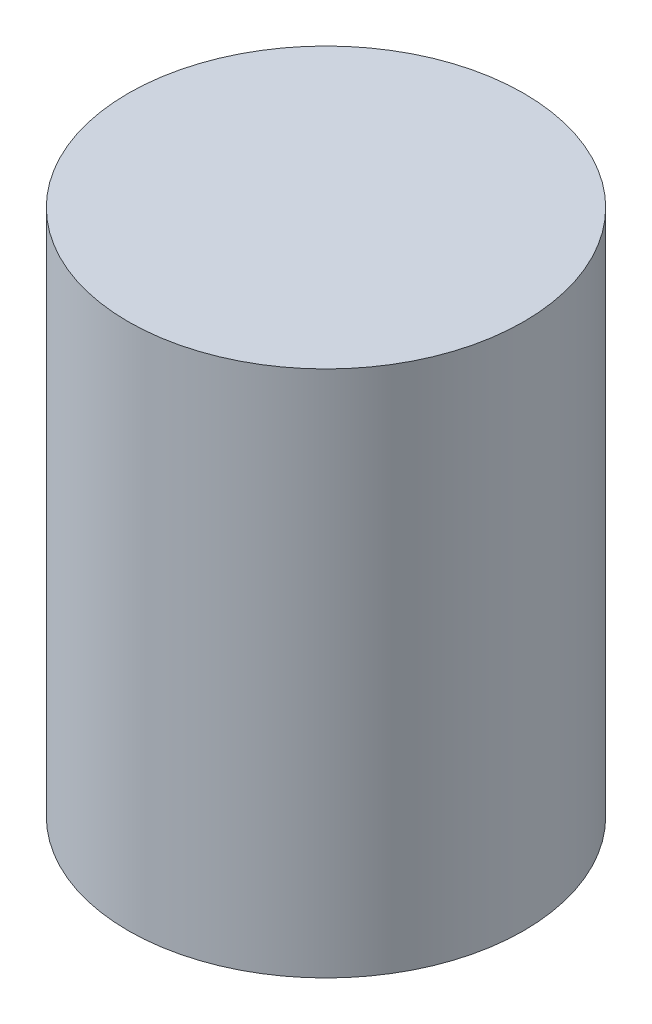
ISO-10303-21;
HEADER;
FILE_DESCRIPTION(('STEP AP214'),'2;1');
FILE_NAME('part.step','',(''),(''),'','','');
FILE_SCHEMA(('AUTOMOTIVE_DESIGN { 1 0 10303 214 1 1 1 1 }'));
ENDSEC;
DATA;
#1=APPLICATION_CONTEXT('core data for automotive mechanical design processes');
#2=APPLICATION_PROTOCOL_DEFINITION('international standard','automotive_design',2000,#1);
#3=PRODUCT_CONTEXT('',#1,'mechanical');
#4=PRODUCT('Part','Part','',(#3));
#5=PRODUCT_RELATED_PRODUCT_CATEGORY('part','',(#4));
#6=PRODUCT_DEFINITION_FORMATION('','',#4);
#7=PRODUCT_DEFINITION_CONTEXT('part definition',#1,'design');
#8=PRODUCT_DEFINITION('design','',#6,#7);
#9=PRODUCT_DEFINITION_SHAPE('','',#8);
#10=(LENGTH_UNIT() NAMED_UNIT(*) SI_UNIT(.MILLI.,.METRE.));
#11=(NAMED_UNIT(*) PLANE_ANGLE_UNIT() SI_UNIT($,.RADIAN.));
#12=(NAMED_UNIT(*) SI_UNIT($,.STERADIAN.) SOLID_ANGLE_UNIT());
#13=UNCERTAINTY_MEASURE_WITH_UNIT(LENGTH_MEASURE(1.E-05),#10,'distance_accuracy_value','');
#14=(GEOMETRIC_REPRESENTATION_CONTEXT(3) GLOBAL_UNCERTAINTY_ASSIGNED_CONTEXT((#13)) GLOBAL_UNIT_ASSIGNED_CONTEXT((#10,
#11,#12)) REPRESENTATION_CONTEXT('',''));
#15=CARTESIAN_POINT('',(0.,0.,0.));
#16=DIRECTION('',(0.,0.,1.));
#17=DIRECTION('',(1.,0.,0.));
#18=AXIS2_PLACEMENT_3D('',#15,#16,#17);
#19=CARTESIAN_POINT('',(0.,20.,0.));
#20=DIRECTION('',(0.,-1.,0.));
#21=DIRECTION('',(0.,0.,-1.));
#22=AXIS2_PLACEMENT_3D('',#19,#20,#21);
#23=CYLINDRICAL_SURFACE('',#22,7.5);
#24=CARTESIAN_POINT('',(0.,20.,0.));
#25=DIRECTION('',(0.,1.,0.));
#26=DIRECTION('',(0.,0.,1.));
#27=AXIS2_PLACEMENT_3D('',#24,#25,#26);
#28=CIRCLE('',#27,7.5);
#29=CARTESIAN_POINT('',(0.,20.,7.5));
#30=VERTEX_POINT('',#29);
#31=EDGE_CURVE('E85',#30,#30,#28,.T.);
#32=ORIENTED_EDGE('',*,*,#31,.F.);
#33=EDGE_LOOP('',(#32));
#34=FACE_BOUND('',#33,.T.);
#35=CARTESIAN_POINT('',(0.,0.,0.));
#36=DIRECTION('',(0.,1.,0.));
#37=DIRECTION('',(0.,0.,1.));
#38=AXIS2_PLACEMENT_3D('',#35,#36,#37);
#39=CIRCLE('',#38,7.5);
#40=CARTESIAN_POINT('',(0.,0.,7.5));
#41=VERTEX_POINT('',#40);
#42=EDGE_CURVE('E84',#41,#41,#39,.T.);
#43=ORIENTED_EDGE('',*,*,#42,.T.);
#44=EDGE_LOOP('',(#43));
#45=FACE_BOUND('',#44,.T.);
#46=ADVANCED_FACE('F35',(#34,#45),#23,.T.);
#47=CARTESIAN_POINT('',(0.,20.,0.));
#48=DIRECTION('',(0.,1.,0.));
#49=DIRECTION('',(0.,0.,1.));
#50=AXIS2_PLACEMENT_3D('',#47,#48,#49);
#51=PLANE('',#50);
#52=ORIENTED_EDGE('',*,*,#31,.T.);
#53=EDGE_LOOP('',(#52));
#54=FACE_BOUND('',#53,.T.);
#55=ADVANCED_FACE('F105',(#54),#51,.T.);
#56=CARTESIAN_POINT('',(0.,0.,0.));
#57=DIRECTION('',(0.,1.,0.));
#58=DIRECTION('',(0.,0.,1.));
#59=AXIS2_PLACEMENT_3D('',#56,#57,#58);
#60=PLANE('',#59);
#61=CARTESIAN_POINT('',(0.,0.,0.));
#62=DIRECTION('',(0.,1.,0.));
#63=DIRECTION('',(0.,0.,1.));
#64=AXIS2_PLACEMENT_3D('',#61,#62,#63);
#65=CIRCLE('',#64,5.57735026918963);
#66=CARTESIAN_POINT('',(0.,0.,5.57735026918963));
#67=VERTEX_POINT('',#66);
#68=EDGE_CURVE('E11',#67,#67,#65,.T.);
#69=ORIENTED_EDGE('',*,*,#68,.T.);
#70=EDGE_LOOP('',(#69));
#71=FACE_BOUND('',#70,.T.);
#72=ORIENTED_EDGE('',*,*,#42,.F.);
#73=EDGE_LOOP('',(#72));
#74=FACE_BOUND('',#73,.T.);
#75=ADVANCED_FACE('F110',(#71,#74),#60,.F.);
#76=CARTESIAN_POINT('',(0.,4.,0.));
#77=DIRECTION('',(0.,-1.,0.));
#78=DIRECTION('',(0.,0.,-1.));
#79=AXIS2_PLACEMENT_3D('',#76,#77,#78);
#80=CYLINDRICAL_SURFACE('',#79,5.);
#81=CARTESIAN_POINT('',(0.,1.00000000000001,0.));
#82=DIRECTION('',(0.,1.,0.));
#83=DIRECTION('',(0.,0.,1.));
#84=AXIS2_PLACEMENT_3D('',#81,#82,#83);
#85=CIRCLE('',#84,5.);
#86=CARTESIAN_POINT('',(0.,1.00000000000001,5.));
#87=VERTEX_POINT('',#86);
#88=EDGE_CURVE('E43',#87,#87,#85,.F.);
#89=ORIENTED_EDGE('',*,*,#88,.T.);
#90=EDGE_LOOP('',(#89));
#91=FACE_BOUND('',#90,.T.);
#92=CARTESIAN_POINT('',(0.,4.,0.));
#93=DIRECTION('',(0.,-1.,0.));
#94=DIRECTION('',(0.,0.,-1.));
#95=AXIS2_PLACEMENT_3D('',#92,#93,#94);
#96=CIRCLE('',#95,5.);
#97=CARTESIAN_POINT('',(0.,4.,-5.));
#98=VERTEX_POINT('',#97);
#99=EDGE_CURVE('E66',#98,#98,#96,.T.);
#100=ORIENTED_EDGE('',*,*,#99,.F.);
#101=EDGE_LOOP('',(#100));
#102=FACE_BOUND('',#101,.T.);
#103=ADVANCED_FACE('F92',(#91,#102),#80,.F.);
#104=CARTESIAN_POINT('',(0.,4.,0.));
#105=DIRECTION('',(0.,-1.,0.));
#106=DIRECTION('',(0.,0.,-1.));
#107=AXIS2_PLACEMENT_3D('',#104,#105,#106);
#108=PLANE('',#107);
#109=CARTESIAN_POINT('',(0.,4.,0.));
#110=DIRECTION('',(0.,-1.,0.));
#111=DIRECTION('',(0.,0.,1.));
#112=AXIS2_PLACEMENT_3D('',#109,#110,#111);
#113=CIRCLE('',#112,3.1);
#114=CARTESIAN_POINT('',(3.04828024000763,4.,-0.563903873349911));
#115=VERTEX_POINT('',#114);
#116=CARTESIAN_POINT('',(-1.73205550705109,4.,-2.57098886043756));
#117=VERTEX_POINT('',#116);
#118=EDGE_CURVE('E50',#115,#117,#113,.T.);
#119=ORIENTED_EDGE('',*,*,#118,.F.);
#120=DIRECTION('',(0.922027274643373,0.,0.387124921457807));
#121=VECTOR('',#120,1.);
#122=CARTESIAN_POINT('',(-1.73205550705109,4.,-2.57098886043756));
#123=LINE('',#122,#121);
#124=EDGE_CURVE('E70',#117,#115,#123,.T.);
#125=ORIENTED_EDGE('',*,*,#124,.F.);
#126=EDGE_LOOP('',(#119,#125));
#127=FACE_BOUND('',#126,.T.);
#128=ORIENTED_EDGE('',*,*,#99,.T.);
#129=EDGE_LOOP('',(#128));
#130=FACE_BOUND('',#129,.T.);
#131=ADVANCED_FACE('F74',(#127,#130),#108,.T.);
#132=CARTESIAN_POINT('',(0.,16.,0.));
#133=DIRECTION('',(0.,-1.,0.));
#134=DIRECTION('',(0.,0.,-1.));
#135=AXIS2_PLACEMENT_3D('',#132,#133,#134);
#136=CYLINDRICAL_SURFACE('',#135,3.1);
#137=ORIENTED_EDGE('',*,*,#118,.T.);
#138=DIRECTION('',(0.,-1.,0.));
#139=VECTOR('',#138,1.);
#140=CARTESIAN_POINT('',(-1.73205550705109,16.,-2.57098886043756));
#141=LINE('',#140,#139);
#142=CARTESIAN_POINT('',(-1.73205550705109,16.,-2.57098886043756));
#143=VERTEX_POINT('',#142);
#144=EDGE_CURVE('E67',#143,#117,#141,.T.);
#145=ORIENTED_EDGE('',*,*,#144,.F.);
#146=CARTESIAN_POINT('',(0.,16.,0.));
#147=DIRECTION('',(0.,-1.,0.));
#148=DIRECTION('',(0.,0.,1.));
#149=AXIS2_PLACEMENT_3D('',#146,#147,#148);
#150=CIRCLE('',#149,3.1);
#151=CARTESIAN_POINT('',(3.04828024000763,16.,-0.563903873349911));
#152=VERTEX_POINT('',#151);
#153=EDGE_CURVE('E64',#152,#143,#150,.T.);
#154=ORIENTED_EDGE('',*,*,#153,.F.);
#155=DIRECTION('',(0.,-1.,0.));
#156=VECTOR('',#155,1.);
#157=CARTESIAN_POINT('',(3.04828024000763,16.,-0.563903873349911));
#158=LINE('',#157,#156);
#159=EDGE_CURVE('E58',#152,#115,#158,.T.);
#160=ORIENTED_EDGE('',*,*,#159,.T.);
#161=EDGE_LOOP('',(#137,#145,#154,#160));
#162=FACE_BOUND('',#161,.T.);
#163=ADVANCED_FACE('F62',(#162),#136,.F.);
#164=CARTESIAN_POINT('',(-1.73205550705109,16.,-2.57098886043756));
#165=DIRECTION('',(0.387124921457807,0.,-0.922027274643373));
#166=DIRECTION('',(-0.922027274643373,0.,-0.387124921457807));
#167=AXIS2_PLACEMENT_3D('',#164,#165,#166);
#168=PLANE('',#167);
#169=ORIENTED_EDGE('',*,*,#124,.T.);
#170=ORIENTED_EDGE('',*,*,#159,.F.);
#171=DIRECTION('',(0.922027274643373,0.,0.387124921457807));
#172=VECTOR('',#171,1.);
#173=CARTESIAN_POINT('',(-1.73205550705109,16.,-2.57098886043756));
#174=LINE('',#173,#172);
#175=EDGE_CURVE('E78',#143,#152,#174,.T.);
#176=ORIENTED_EDGE('',*,*,#175,.F.);
#177=ORIENTED_EDGE('',*,*,#144,.T.);
#178=EDGE_LOOP('',(#169,#170,#176,#177));
#179=FACE_BOUND('',#178,.T.);
#180=ADVANCED_FACE('F71',(#179),#168,.F.);
#181=CARTESIAN_POINT('',(0.,16.,0.));
#182=DIRECTION('',(0.,1.,0.));
#183=DIRECTION('',(0.,0.,1.));
#184=AXIS2_PLACEMENT_3D('',#181,#182,#183);
#185=PLANE('',#184);
#186=ORIENTED_EDGE('',*,*,#153,.T.);
#187=ORIENTED_EDGE('',*,*,#175,.T.);
#188=EDGE_LOOP('',(#186,#187));
#189=FACE_BOUND('',#188,.T.);
#190=ADVANCED_FACE('F96',(#189),#185,.F.);
#191=CARTESIAN_POINT('',(0.,1.00000000000001,0.));
#192=DIRECTION('',(0.,-1.,0.));
#193=DIRECTION('',(0.,0.,-1.));
#194=AXIS2_PLACEMENT_3D('',#191,#192,#193);
#195=CONICAL_SURFACE('',#194,5.,0.523598775598296);
#196=ORIENTED_EDGE('',*,*,#68,.F.);
#197=EDGE_LOOP('',(#196));
#198=FACE_BOUND('',#197,.T.);
#199=ORIENTED_EDGE('',*,*,#88,.F.);
#200=EDGE_LOOP('',(#199));
#201=FACE_BOUND('',#200,.T.);
#202=ADVANCED_FACE('F37',(#198,#201),#195,.F.);
#203=CLOSED_SHELL('',(#46,#55,#75,#103,#131,#163,#180,#190,#202));
#204=MANIFOLD_SOLID_BREP('B2',#203);
#205=ADVANCED_BREP_SHAPE_REPRESENTATION('',(#18,#204),#14);
#206=SHAPE_DEFINITION_REPRESENTATION(#9,#205);
ENDSEC;
END-ISO-10303-21;
